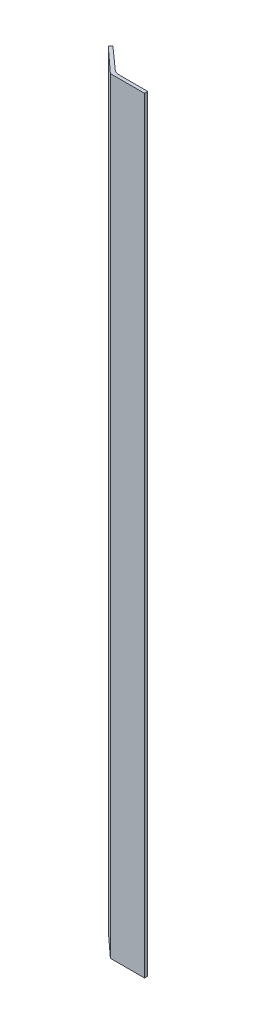
ISO-10303-21;
HEADER;
FILE_DESCRIPTION(('STEP AP214'),'2;1');
FILE_NAME('part.step','',(''),(''),'','','');
FILE_SCHEMA(('AUTOMOTIVE_DESIGN { 1 0 10303 214 1 1 1 1 }'));
ENDSEC;
DATA;
#1=APPLICATION_CONTEXT('core data for automotive mechanical design processes');
#2=APPLICATION_PROTOCOL_DEFINITION('international standard','automotive_design',2000,#1);
#3=PRODUCT_CONTEXT('',#1,'mechanical');
#4=PRODUCT('Part','Part','',(#3));
#5=PRODUCT_RELATED_PRODUCT_CATEGORY('part','',(#4));
#6=PRODUCT_DEFINITION_FORMATION('','',#4);
#7=PRODUCT_DEFINITION_CONTEXT('part definition',#1,'design');
#8=PRODUCT_DEFINITION('design','',#6,#7);
#9=PRODUCT_DEFINITION_SHAPE('','',#8);
#10=(LENGTH_UNIT() NAMED_UNIT(*) SI_UNIT(.MILLI.,.METRE.));
#11=(NAMED_UNIT(*) PLANE_ANGLE_UNIT() SI_UNIT($,.RADIAN.));
#12=(NAMED_UNIT(*) SI_UNIT($,.STERADIAN.) SOLID_ANGLE_UNIT());
#13=UNCERTAINTY_MEASURE_WITH_UNIT(LENGTH_MEASURE(1.E-05),#10,'distance_accuracy_value','');
#14=(GEOMETRIC_REPRESENTATION_CONTEXT(3) GLOBAL_UNCERTAINTY_ASSIGNED_CONTEXT((#13)) GLOBAL_UNIT_ASSIGNED_CONTEXT((#10,
#11,#12)) REPRESENTATION_CONTEXT('',''));
#15=CARTESIAN_POINT('',(0.,0.,0.));
#16=DIRECTION('',(0.,0.,1.));
#17=DIRECTION('',(1.,0.,0.));
#18=AXIS2_PLACEMENT_3D('',#15,#16,#17);
#19=CARTESIAN_POINT('',(-0.644564968595473,40.,-5.48688166985293));
#20=DIRECTION('',(0.,-1.,0.));
#21=DIRECTION('',(0.,0.,-1.));
#22=AXIS2_PLACEMENT_3D('',#19,#20,#21);
#23=PLANE('',#22);
#24=CARTESIAN_POINT('',(-0.644564968595473,40.,-5.48688166985293));
#25=DIRECTION('',(0.,-1.,0.));
#26=DIRECTION('',(0.,0.,-1.));
#27=AXIS2_PLACEMENT_3D('',#24,#25,#26);
#28=CIRCLE('',#27,5.);
#29=CARTESIAN_POINT('',(-0.644564968595473,40.,-0.486881669852926));
#30=VERTEX_POINT('',#29);
#31=CARTESIAN_POINT('',(-3.97119008025955,40.,-1.75411254138463));
#32=VERTEX_POINT('',#31);
#33=EDGE_CURVE('E104',#30,#32,#28,.T.);
#34=ORIENTED_EDGE('',*,*,#33,.F.);
#35=DIRECTION('',(-1.,0.,0.));
#36=VECTOR('',#35,1.);
#37=CARTESIAN_POINT('',(-0.644564968595473,40.,-0.486881669852926));
#38=LINE('',#37,#36);
#39=CARTESIAN_POINT('',(17.1228290420735,40.,-0.486881669852926));
#40=VERTEX_POINT('',#39);
#41=EDGE_CURVE('E125',#40,#30,#38,.T.);
#42=ORIENTED_EDGE('',*,*,#41,.F.);
#43=DIRECTION('',(0.,0.,-1.));
#44=VECTOR('',#43,1.);
#45=CARTESIAN_POINT('',(17.1228290420735,40.,1.51311833014707));
#46=LINE('',#45,#44);
#47=CARTESIAN_POINT('',(17.1228290420735,40.,1.51311833014707));
#48=VERTEX_POINT('',#47);
#49=EDGE_CURVE('E122',#48,#40,#46,.T.);
#50=ORIENTED_EDGE('',*,*,#49,.F.);
#51=DIRECTION('',(1.,0.,0.));
#52=VECTOR('',#51,1.);
#53=CARTESIAN_POINT('',(-3.70464164013991,40.,1.51311833014707));
#54=LINE('',#53,#52);
#55=CARTESIAN_POINT('',(-3.70464164013991,40.,1.51311833014707));
#56=VERTEX_POINT('',#55);
#57=EDGE_CURVE('E119',#56,#48,#54,.T.);
#58=ORIENTED_EDGE('',*,*,#57,.F.);
#59=DIRECTION('',(0.738028812002272,0.,0.674769199544937));
#60=VECTOR('',#59,1.);
#61=CARTESIAN_POINT('',(-18.9022865177283,40.,-12.3818712722195));
#62=LINE('',#61,#60);
#63=CARTESIAN_POINT('',(-18.9022865177283,40.,-12.3818712722195));
#64=VERTEX_POINT('',#63);
#65=EDGE_CURVE('E116',#64,#56,#62,.T.);
#66=ORIENTED_EDGE('',*,*,#65,.F.);
#67=DIRECTION('',(-0.674769199544937,0.,0.738028812002272));
#68=VECTOR('',#67,1.);
#69=CARTESIAN_POINT('',(-18.9022865177283,40.,-12.3818712722195));
#70=LINE('',#69,#68);
#71=CARTESIAN_POINT('',(-17.5527481186384,40.,-13.857928896224));
#72=VERTEX_POINT('',#71);
#73=EDGE_CURVE('E107',#72,#64,#70,.T.);
#74=ORIENTED_EDGE('',*,*,#73,.F.);
#75=DIRECTION('',(-0.74655382569366,0.,-0.665325022332815));
#76=VECTOR('',#75,1.);
#77=CARTESIAN_POINT('',(-17.5527481186384,40.,-13.857928896224));
#78=LINE('',#77,#76);
#79=EDGE_CURVE('E96',#32,#72,#78,.T.);
#80=ORIENTED_EDGE('',*,*,#79,.F.);
#81=EDGE_LOOP('',(#34,#42,#50,#58,#66,#74,#80));
#82=FACE_BOUND('',#81,.T.);
#83=ADVANCED_FACE('F31',(#82),#23,.T.);
#84=CARTESIAN_POINT('',(-0.644564968595473,547.38098167368,-0.486881669852926));
#85=DIRECTION('',(0.,0.,1.));
#86=DIRECTION('',(1.,0.,0.));
#87=AXIS2_PLACEMENT_3D('',#84,#85,#86);
#88=PLANE('',#87);
#89=DIRECTION('',(0.,-1.,0.));
#90=VECTOR('',#89,1.);
#91=CARTESIAN_POINT('',(-0.644564968595473,547.38098167368,-0.486881669852926));
#92=LINE('',#91,#90);
#93=CARTESIAN_POINT('',(-0.644564968595473,508.213673316679,-0.486881669852926));
#94=VERTEX_POINT('',#93);
#95=EDGE_CURVE('E110',#94,#30,#92,.T.);
#96=ORIENTED_EDGE('',*,*,#95,.F.);
#97=DIRECTION('',(1.,0.,0.));
#98=VECTOR('',#97,1.);
#99=CARTESIAN_POINT('',(-0.644564968595477,508.213673316679,-0.486881669852926));
#100=LINE('',#99,#98);
#101=CARTESIAN_POINT('',(17.1228290420735,508.213673316679,-0.486881669852926));
#102=VERTEX_POINT('',#101);
#103=EDGE_CURVE('E35',#94,#102,#100,.T.);
#104=ORIENTED_EDGE('',*,*,#103,.T.);
#105=DIRECTION('',(0.,-1.,0.));
#106=VECTOR('',#105,1.);
#107=CARTESIAN_POINT('',(17.1228290420735,547.38098167368,-0.486881669852926));
#108=LINE('',#107,#106);
#109=EDGE_CURVE('E128',#102,#40,#108,.T.);
#110=ORIENTED_EDGE('',*,*,#109,.T.);
#111=ORIENTED_EDGE('',*,*,#41,.T.);
#112=EDGE_LOOP('',(#96,#104,#110,#111));
#113=FACE_BOUND('',#112,.T.);
#114=ADVANCED_FACE('F150',(#113),#88,.F.);
#115=CARTESIAN_POINT('',(17.1228290420735,547.38098167368,1.51311833014707));
#116=DIRECTION('',(-1.,0.,0.));
#117=DIRECTION('',(0.,0.,1.));
#118=AXIS2_PLACEMENT_3D('',#115,#116,#117);
#119=PLANE('',#118);
#120=ORIENTED_EDGE('',*,*,#109,.F.);
#121=DIRECTION('',(0.,0.,1.));
#122=VECTOR('',#121,1.);
#123=CARTESIAN_POINT('',(17.1228290420735,508.213673316679,1.51311833014706));
#124=LINE('',#123,#122);
#125=CARTESIAN_POINT('',(17.1228290420735,508.213673316679,1.51311833014707));
#126=VERTEX_POINT('',#125);
#127=EDGE_CURVE('E144',#102,#126,#124,.T.);
#128=ORIENTED_EDGE('',*,*,#127,.T.);
#129=DIRECTION('',(0.,-1.,0.));
#130=VECTOR('',#129,1.);
#131=CARTESIAN_POINT('',(17.1228290420735,547.38098167368,1.51311833014707));
#132=LINE('',#131,#130);
#133=EDGE_CURVE('E130',#126,#48,#132,.T.);
#134=ORIENTED_EDGE('',*,*,#133,.T.);
#135=ORIENTED_EDGE('',*,*,#49,.T.);
#136=EDGE_LOOP('',(#120,#128,#134,#135));
#137=FACE_BOUND('',#136,.T.);
#138=ADVANCED_FACE('F152',(#137),#119,.F.);
#139=CARTESIAN_POINT('',(-3.70464164013991,547.38098167368,1.51311833014707));
#140=DIRECTION('',(0.,0.,-1.));
#141=DIRECTION('',(-1.,0.,0.));
#142=AXIS2_PLACEMENT_3D('',#139,#140,#141);
#143=PLANE('',#142);
#144=ORIENTED_EDGE('',*,*,#133,.F.);
#145=DIRECTION('',(-1.,0.,0.));
#146=VECTOR('',#145,1.);
#147=CARTESIAN_POINT('',(-3.70464164013991,508.213673316679,1.51311833014707));
#148=LINE('',#147,#146);
#149=CARTESIAN_POINT('',(-3.70464164013991,508.213673316679,1.51311833014707));
#150=VERTEX_POINT('',#149);
#151=EDGE_CURVE('E50',#126,#150,#148,.T.);
#152=ORIENTED_EDGE('',*,*,#151,.T.);
#153=DIRECTION('',(0.,-1.,0.));
#154=VECTOR('',#153,1.);
#155=CARTESIAN_POINT('',(-3.70464164013991,547.38098167368,1.51311833014707));
#156=LINE('',#155,#154);
#157=EDGE_CURVE('E132',#150,#56,#156,.T.);
#158=ORIENTED_EDGE('',*,*,#157,.T.);
#159=ORIENTED_EDGE('',*,*,#57,.T.);
#160=EDGE_LOOP('',(#144,#152,#158,#159));
#161=FACE_BOUND('',#160,.T.);
#162=ADVANCED_FACE('F156',(#161),#143,.F.);
#163=CARTESIAN_POINT('',(-18.9022865177283,547.38098167368,-12.3818712722195));
#164=DIRECTION('',(0.674769199544937,0.,-0.738028812002272));
#165=DIRECTION('',(-0.738028812002272,0.,-0.674769199544937));
#166=AXIS2_PLACEMENT_3D('',#163,#164,#165);
#167=PLANE('',#166);
#168=ORIENTED_EDGE('',*,*,#157,.F.);
#169=DIRECTION('',(-0.738028812002272,0.,-0.674769199544937));
#170=VECTOR('',#169,1.);
#171=CARTESIAN_POINT('',(-18.9022865177283,508.213673316679,-12.3818712722195));
#172=LINE('',#171,#170);
#173=CARTESIAN_POINT('',(-18.9022865177283,508.213673316679,-12.3818712722195));
#174=VERTEX_POINT('',#173);
#175=EDGE_CURVE('E139',#150,#174,#172,.T.);
#176=ORIENTED_EDGE('',*,*,#175,.T.);
#177=DIRECTION('',(0.,-1.,0.));
#178=VECTOR('',#177,1.);
#179=CARTESIAN_POINT('',(-18.9022865177283,547.38098167368,-12.3818712722195));
#180=LINE('',#179,#178);
#181=EDGE_CURVE('E134',#174,#64,#180,.T.);
#182=ORIENTED_EDGE('',*,*,#181,.T.);
#183=ORIENTED_EDGE('',*,*,#65,.T.);
#184=EDGE_LOOP('',(#168,#176,#182,#183));
#185=FACE_BOUND('',#184,.T.);
#186=ADVANCED_FACE('F159',(#185),#167,.F.);
#187=CARTESIAN_POINT('',(-18.9022865177283,547.38098167368,-12.3818712722195));
#188=DIRECTION('',(0.738028812002272,0.,0.674769199544937));
#189=DIRECTION('',(0.674769199544937,0.,-0.738028812002272));
#190=AXIS2_PLACEMENT_3D('',#187,#188,#189);
#191=PLANE('',#190);
#192=ORIENTED_EDGE('',*,*,#181,.F.);
#193=DIRECTION('',(0.674769199544937,0.,-0.738028812002272));
#194=VECTOR('',#193,1.);
#195=CARTESIAN_POINT('',(-18.9022865177283,508.213673316679,-12.3818712722195));
#196=LINE('',#195,#194);
#197=CARTESIAN_POINT('',(-17.5527481186384,508.213673316679,-13.857928896224));
#198=VERTEX_POINT('',#197);
#199=EDGE_CURVE('E60',#174,#198,#196,.T.);
#200=ORIENTED_EDGE('',*,*,#199,.T.);
#201=DIRECTION('',(0.,-1.,0.));
#202=VECTOR('',#201,1.);
#203=CARTESIAN_POINT('',(-17.5527481186384,547.38098167368,-13.857928896224));
#204=LINE('',#203,#202);
#205=EDGE_CURVE('E100',#198,#72,#204,.T.);
#206=ORIENTED_EDGE('',*,*,#205,.T.);
#207=ORIENTED_EDGE('',*,*,#73,.T.);
#208=EDGE_LOOP('',(#192,#200,#206,#207));
#209=FACE_BOUND('',#208,.T.);
#210=ADVANCED_FACE('F137',(#209),#191,.F.);
#211=CARTESIAN_POINT('',(-17.5527481186384,547.38098167368,-13.857928896224));
#212=DIRECTION('',(-0.665325022332815,0.,0.74655382569366));
#213=DIRECTION('',(0.74655382569366,0.,0.665325022332815));
#214=AXIS2_PLACEMENT_3D('',#211,#212,#213);
#215=PLANE('',#214);
#216=ORIENTED_EDGE('',*,*,#205,.F.);
#217=DIRECTION('',(0.74655382569366,0.,0.665325022332815));
#218=VECTOR('',#217,1.);
#219=CARTESIAN_POINT('',(-17.5527481186384,508.213673316679,-13.857928896224));
#220=LINE('',#219,#218);
#221=CARTESIAN_POINT('',(-3.97119008025955,508.213673316679,-1.75411254138463));
#222=VERTEX_POINT('',#221);
#223=EDGE_CURVE('E41',#198,#222,#220,.T.);
#224=ORIENTED_EDGE('',*,*,#223,.T.);
#225=DIRECTION('',(0.,-1.,0.));
#226=VECTOR('',#225,1.);
#227=CARTESIAN_POINT('',(-3.97119008025955,547.38098167368,-1.75411254138463));
#228=LINE('',#227,#226);
#229=EDGE_CURVE('E93',#222,#32,#228,.T.);
#230=ORIENTED_EDGE('',*,*,#229,.T.);
#231=ORIENTED_EDGE('',*,*,#79,.T.);
#232=EDGE_LOOP('',(#216,#224,#230,#231));
#233=FACE_BOUND('',#232,.T.);
#234=ADVANCED_FACE('F95',(#233),#215,.F.);
#235=CARTESIAN_POINT('',(-0.644564968595473,547.38098167368,-5.48688166985293));
#236=DIRECTION('',(0.,-1.,0.));
#237=DIRECTION('',(0.,0.,-1.));
#238=AXIS2_PLACEMENT_3D('',#235,#236,#237);
#239=CYLINDRICAL_SURFACE('',#238,5.);
#240=ORIENTED_EDGE('',*,*,#229,.F.);
#241=CARTESIAN_POINT('',(-0.644564968595473,508.213673316679,-5.48688166985293));
#242=DIRECTION('',(0.,-1.,0.));
#243=DIRECTION('',(0.,0.,-1.));
#244=AXIS2_PLACEMENT_3D('',#241,#242,#243);
#245=CIRCLE('',#244,5.);
#246=EDGE_CURVE('E11',#222,#94,#245,.F.);
#247=ORIENTED_EDGE('',*,*,#246,.T.);
#248=ORIENTED_EDGE('',*,*,#95,.T.);
#249=ORIENTED_EDGE('',*,*,#33,.T.);
#250=EDGE_LOOP('',(#240,#247,#248,#249));
#251=FACE_BOUND('',#250,.T.);
#252=ADVANCED_FACE('F33',(#251),#239,.F.);
#253=CARTESIAN_POINT('',(46.699097286722,508.213673316679,5.51311833014725));
#254=DIRECTION('',(0.,-1.,0.));
#255=DIRECTION('',(0.,0.,1.));
#256=AXIS2_PLACEMENT_3D('',#253,#254,#255);
#257=PLANE('',#256);
#258=ORIENTED_EDGE('',*,*,#223,.F.);
#259=ORIENTED_EDGE('',*,*,#199,.F.);
#260=ORIENTED_EDGE('',*,*,#175,.F.);
#261=ORIENTED_EDGE('',*,*,#151,.F.);
#262=ORIENTED_EDGE('',*,*,#127,.F.);
#263=ORIENTED_EDGE('',*,*,#103,.F.);
#264=ORIENTED_EDGE('',*,*,#246,.F.);
#265=EDGE_LOOP('',(#258,#259,#260,#261,#262,#263,#264));
#266=FACE_BOUND('',#265,.T.);
#267=ADVANCED_FACE('F151',(#266),#257,.F.);
#268=CLOSED_SHELL('',(#83,#114,#138,#162,#186,#210,#234,#252,#267));
#269=MANIFOLD_SOLID_BREP('B2',#268);
#270=ADVANCED_BREP_SHAPE_REPRESENTATION('',(#18,#269),#14);
#271=SHAPE_DEFINITION_REPRESENTATION(#9,#270);
ENDSEC;
END-ISO-10303-21;
